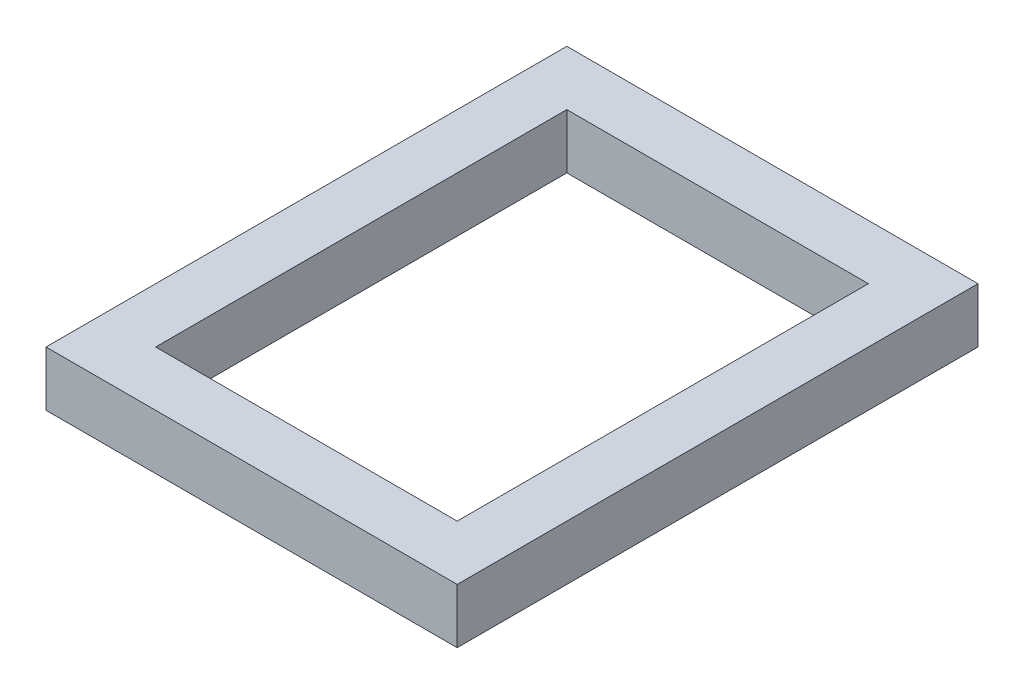
ISO-10303-21;
HEADER;
FILE_DESCRIPTION(('STEP AP214'),'2;1');
FILE_NAME('part.step','',(''),(''),'','','');
FILE_SCHEMA(('AUTOMOTIVE_DESIGN { 1 0 10303 214 1 1 1 1 }'));
ENDSEC;
DATA;
#1=APPLICATION_CONTEXT('core data for automotive mechanical design processes');
#2=APPLICATION_PROTOCOL_DEFINITION('international standard','automotive_design',2000,#1);
#3=PRODUCT_CONTEXT('',#1,'mechanical');
#4=PRODUCT('Part','Part','',(#3));
#5=PRODUCT_RELATED_PRODUCT_CATEGORY('part','',(#4));
#6=PRODUCT_DEFINITION_FORMATION('','',#4);
#7=PRODUCT_DEFINITION_CONTEXT('part definition',#1,'design');
#8=PRODUCT_DEFINITION('design','',#6,#7);
#9=PRODUCT_DEFINITION_SHAPE('','',#8);
#10=(LENGTH_UNIT() NAMED_UNIT(*) SI_UNIT(.MILLI.,.METRE.));
#11=(NAMED_UNIT(*) PLANE_ANGLE_UNIT() SI_UNIT($,.RADIAN.));
#12=(NAMED_UNIT(*) SI_UNIT($,.STERADIAN.) SOLID_ANGLE_UNIT());
#13=UNCERTAINTY_MEASURE_WITH_UNIT(LENGTH_MEASURE(1.E-05),#10,'distance_accuracy_value','');
#14=(GEOMETRIC_REPRESENTATION_CONTEXT(3) GLOBAL_UNCERTAINTY_ASSIGNED_CONTEXT((#13)) GLOBAL_UNIT_ASSIGNED_CONTEXT((#10,
#11,#12)) REPRESENTATION_CONTEXT('',''));
#15=CARTESIAN_POINT('',(0.,0.,0.));
#16=DIRECTION('',(0.,0.,1.));
#17=DIRECTION('',(1.,0.,0.));
#18=AXIS2_PLACEMENT_3D('',#15,#16,#17);
#19=CARTESIAN_POINT('',(0.,12.7,0.));
#20=DIRECTION('',(0.,-1.,0.));
#21=DIRECTION('',(0.,0.,-1.));
#22=AXIS2_PLACEMENT_3D('',#19,#20,#21);
#23=PLANE('',#22);
#24=DIRECTION('',(0.,0.,-1.));
#25=VECTOR('',#24,1.);
#26=CARTESIAN_POINT('',(47.625,12.7,60.325));
#27=LINE('',#26,#25);
#28=CARTESIAN_POINT('',(47.625,12.7,60.325));
#29=VERTEX_POINT('',#28);
#30=CARTESIAN_POINT('',(47.625,12.7,-60.325));
#31=VERTEX_POINT('',#30);
#32=EDGE_CURVE('E134',#29,#31,#27,.T.);
#33=ORIENTED_EDGE('',*,*,#32,.T.);
#34=DIRECTION('',(-1.,0.,0.));
#35=VECTOR('',#34,1.);
#36=CARTESIAN_POINT('',(-47.625,12.7,-60.325));
#37=LINE('',#36,#35);
#38=CARTESIAN_POINT('',(-47.625,12.7,-60.325));
#39=VERTEX_POINT('',#38);
#40=EDGE_CURVE('E137',#31,#39,#37,.T.);
#41=ORIENTED_EDGE('',*,*,#40,.T.);
#42=DIRECTION('',(0.,0.,1.));
#43=VECTOR('',#42,1.);
#44=CARTESIAN_POINT('',(-47.625,12.7,60.325));
#45=LINE('',#44,#43);
#46=CARTESIAN_POINT('',(-47.625,12.7,60.325));
#47=VERTEX_POINT('',#46);
#48=EDGE_CURVE('E140',#39,#47,#45,.T.);
#49=ORIENTED_EDGE('',*,*,#48,.T.);
#50=DIRECTION('',(1.,0.,0.));
#51=VECTOR('',#50,1.);
#52=CARTESIAN_POINT('',(-47.625,12.7,60.325));
#53=LINE('',#52,#51);
#54=EDGE_CURVE('E142',#47,#29,#53,.T.);
#55=ORIENTED_EDGE('',*,*,#54,.T.);
#56=EDGE_LOOP('',(#33,#41,#49,#55));
#57=FACE_BOUND('',#56,.T.);
#58=DIRECTION('',(0.,0.,-1.));
#59=VECTOR('',#58,1.);
#60=CARTESIAN_POINT('',(34.925,12.7,47.625));
#61=LINE('',#60,#59);
#62=CARTESIAN_POINT('',(34.925,12.7,47.625));
#63=VERTEX_POINT('',#62);
#64=CARTESIAN_POINT('',(34.925,12.7,-47.625));
#65=VERTEX_POINT('',#64);
#66=EDGE_CURVE('E98',#63,#65,#61,.T.);
#67=ORIENTED_EDGE('',*,*,#66,.F.);
#68=DIRECTION('',(1.,0.,0.));
#69=VECTOR('',#68,1.);
#70=CARTESIAN_POINT('',(-34.925,12.7,47.625));
#71=LINE('',#70,#69);
#72=CARTESIAN_POINT('',(-34.925,12.7,47.625));
#73=VERTEX_POINT('',#72);
#74=EDGE_CURVE('E120',#73,#63,#71,.T.);
#75=ORIENTED_EDGE('',*,*,#74,.F.);
#76=DIRECTION('',(0.,0.,1.));
#77=VECTOR('',#76,1.);
#78=CARTESIAN_POINT('',(-34.925,12.7,47.625));
#79=LINE('',#78,#77);
#80=CARTESIAN_POINT('',(-34.925,12.7,-47.625));
#81=VERTEX_POINT('',#80);
#82=EDGE_CURVE('E118',#81,#73,#79,.T.);
#83=ORIENTED_EDGE('',*,*,#82,.F.);
#84=DIRECTION('',(-1.,0.,0.));
#85=VECTOR('',#84,1.);
#86=CARTESIAN_POINT('',(-34.925,12.7,-47.625));
#87=LINE('',#86,#85);
#88=EDGE_CURVE('E106',#65,#81,#87,.T.);
#89=ORIENTED_EDGE('',*,*,#88,.F.);
#90=EDGE_LOOP('',(#67,#75,#83,#89));
#91=FACE_BOUND('',#90,.T.);
#92=ADVANCED_FACE('F33',(#57,#91),#23,.F.);
#93=CARTESIAN_POINT('',(0.,0.,0.));
#94=DIRECTION('',(0.,-1.,0.));
#95=DIRECTION('',(0.,0.,-1.));
#96=AXIS2_PLACEMENT_3D('',#93,#94,#95);
#97=PLANE('',#96);
#98=DIRECTION('',(0.,0.,-1.));
#99=VECTOR('',#98,1.);
#100=CARTESIAN_POINT('',(47.625,0.,60.325));
#101=LINE('',#100,#99);
#102=CARTESIAN_POINT('',(47.625,0.,60.325));
#103=VERTEX_POINT('',#102);
#104=CARTESIAN_POINT('',(47.625,0.,-60.325));
#105=VERTEX_POINT('',#104);
#106=EDGE_CURVE('E114',#103,#105,#101,.T.);
#107=ORIENTED_EDGE('',*,*,#106,.F.);
#108=DIRECTION('',(1.,0.,0.));
#109=VECTOR('',#108,1.);
#110=CARTESIAN_POINT('',(-47.625,0.,60.325));
#111=LINE('',#110,#109);
#112=CARTESIAN_POINT('',(-47.625,0.,60.325));
#113=VERTEX_POINT('',#112);
#114=EDGE_CURVE('E138',#113,#103,#111,.T.);
#115=ORIENTED_EDGE('',*,*,#114,.F.);
#116=DIRECTION('',(0.,0.,1.));
#117=VECTOR('',#116,1.);
#118=CARTESIAN_POINT('',(-47.625,0.,60.325));
#119=LINE('',#118,#117);
#120=CARTESIAN_POINT('',(-47.625,0.,-60.325));
#121=VERTEX_POINT('',#120);
#122=EDGE_CURVE('E149',#121,#113,#119,.T.);
#123=ORIENTED_EDGE('',*,*,#122,.F.);
#124=DIRECTION('',(-1.,0.,0.));
#125=VECTOR('',#124,1.);
#126=CARTESIAN_POINT('',(-47.625,0.,-60.325));
#127=LINE('',#126,#125);
#128=EDGE_CURVE('E147',#105,#121,#127,.T.);
#129=ORIENTED_EDGE('',*,*,#128,.F.);
#130=EDGE_LOOP('',(#107,#115,#123,#129));
#131=FACE_BOUND('',#130,.T.);
#132=DIRECTION('',(1.,0.,0.));
#133=VECTOR('',#132,1.);
#134=CARTESIAN_POINT('',(-34.925,0.,47.625));
#135=LINE('',#134,#133);
#136=CARTESIAN_POINT('',(-34.925,0.,47.625));
#137=VERTEX_POINT('',#136);
#138=CARTESIAN_POINT('',(34.925,0.,47.625));
#139=VERTEX_POINT('',#138);
#140=EDGE_CURVE('E107',#137,#139,#135,.T.);
#141=ORIENTED_EDGE('',*,*,#140,.T.);
#142=DIRECTION('',(0.,0.,-1.));
#143=VECTOR('',#142,1.);
#144=CARTESIAN_POINT('',(34.925,0.,47.625));
#145=LINE('',#144,#143);
#146=CARTESIAN_POINT('',(34.925,0.,-47.625));
#147=VERTEX_POINT('',#146);
#148=EDGE_CURVE('E56',#139,#147,#145,.T.);
#149=ORIENTED_EDGE('',*,*,#148,.T.);
#150=DIRECTION('',(-1.,0.,0.));
#151=VECTOR('',#150,1.);
#152=CARTESIAN_POINT('',(-34.925,0.,-47.625));
#153=LINE('',#152,#151);
#154=CARTESIAN_POINT('',(-34.925,0.,-47.625));
#155=VERTEX_POINT('',#154);
#156=EDGE_CURVE('E113',#147,#155,#153,.T.);
#157=ORIENTED_EDGE('',*,*,#156,.T.);
#158=DIRECTION('',(0.,0.,1.));
#159=VECTOR('',#158,1.);
#160=CARTESIAN_POINT('',(-34.925,0.,47.625));
#161=LINE('',#160,#159);
#162=EDGE_CURVE('E126',#155,#137,#161,.T.);
#163=ORIENTED_EDGE('',*,*,#162,.T.);
#164=EDGE_LOOP('',(#141,#149,#157,#163));
#165=FACE_BOUND('',#164,.T.);
#166=ADVANCED_FACE('F167',(#131,#165),#97,.T.);
#167=CARTESIAN_POINT('',(47.625,12.7,60.325));
#168=DIRECTION('',(-1.,0.,0.));
#169=DIRECTION('',(0.,0.,1.));
#170=AXIS2_PLACEMENT_3D('',#167,#168,#169);
#171=PLANE('',#170);
#172=ORIENTED_EDGE('',*,*,#106,.T.);
#173=DIRECTION('',(0.,-1.,0.));
#174=VECTOR('',#173,1.);
#175=CARTESIAN_POINT('',(47.625,12.7,-60.325));
#176=LINE('',#175,#174);
#177=EDGE_CURVE('E11',#31,#105,#176,.T.);
#178=ORIENTED_EDGE('',*,*,#177,.F.);
#179=ORIENTED_EDGE('',*,*,#32,.F.);
#180=DIRECTION('',(0.,-1.,0.));
#181=VECTOR('',#180,1.);
#182=CARTESIAN_POINT('',(47.625,12.7,60.325));
#183=LINE('',#182,#181);
#184=EDGE_CURVE('E144',#29,#103,#183,.T.);
#185=ORIENTED_EDGE('',*,*,#184,.T.);
#186=EDGE_LOOP('',(#172,#178,#179,#185));
#187=FACE_BOUND('',#186,.T.);
#188=ADVANCED_FACE('F35',(#187),#171,.F.);
#189=CARTESIAN_POINT('',(-47.625,12.7,-60.325));
#190=DIRECTION('',(0.,0.,1.));
#191=DIRECTION('',(1.,0.,0.));
#192=AXIS2_PLACEMENT_3D('',#189,#190,#191);
#193=PLANE('',#192);
#194=ORIENTED_EDGE('',*,*,#128,.T.);
#195=DIRECTION('',(0.,-1.,0.));
#196=VECTOR('',#195,1.);
#197=CARTESIAN_POINT('',(-47.625,12.7,-60.325));
#198=LINE('',#197,#196);
#199=EDGE_CURVE('E41',#39,#121,#198,.T.);
#200=ORIENTED_EDGE('',*,*,#199,.F.);
#201=ORIENTED_EDGE('',*,*,#40,.F.);
#202=ORIENTED_EDGE('',*,*,#177,.T.);
#203=EDGE_LOOP('',(#194,#200,#201,#202));
#204=FACE_BOUND('',#203,.T.);
#205=ADVANCED_FACE('F177',(#204),#193,.F.);
#206=CARTESIAN_POINT('',(-47.625,12.7,60.325));
#207=DIRECTION('',(1.,0.,0.));
#208=DIRECTION('',(0.,0.,-1.));
#209=AXIS2_PLACEMENT_3D('',#206,#207,#208);
#210=PLANE('',#209);
#211=ORIENTED_EDGE('',*,*,#122,.T.);
#212=DIRECTION('',(0.,-1.,0.));
#213=VECTOR('',#212,1.);
#214=CARTESIAN_POINT('',(-47.625,12.7,60.325));
#215=LINE('',#214,#213);
#216=EDGE_CURVE('E154',#47,#113,#215,.T.);
#217=ORIENTED_EDGE('',*,*,#216,.F.);
#218=ORIENTED_EDGE('',*,*,#48,.F.);
#219=ORIENTED_EDGE('',*,*,#199,.T.);
#220=EDGE_LOOP('',(#211,#217,#218,#219));
#221=FACE_BOUND('',#220,.T.);
#222=ADVANCED_FACE('F161',(#221),#210,.F.);
#223=CARTESIAN_POINT('',(-47.625,12.7,60.325));
#224=DIRECTION('',(0.,0.,-1.));
#225=DIRECTION('',(-1.,0.,0.));
#226=AXIS2_PLACEMENT_3D('',#223,#224,#225);
#227=PLANE('',#226);
#228=ORIENTED_EDGE('',*,*,#114,.T.);
#229=ORIENTED_EDGE('',*,*,#184,.F.);
#230=ORIENTED_EDGE('',*,*,#54,.F.);
#231=ORIENTED_EDGE('',*,*,#216,.T.);
#232=EDGE_LOOP('',(#228,#229,#230,#231));
#233=FACE_BOUND('',#232,.T.);
#234=ADVANCED_FACE('F171',(#233),#227,.F.);
#235=CARTESIAN_POINT('',(34.925,12.7,47.625));
#236=DIRECTION('',(-1.,0.,0.));
#237=DIRECTION('',(0.,0.,1.));
#238=AXIS2_PLACEMENT_3D('',#235,#236,#237);
#239=PLANE('',#238);
#240=ORIENTED_EDGE('',*,*,#148,.F.);
#241=DIRECTION('',(0.,-1.,0.));
#242=VECTOR('',#241,1.);
#243=CARTESIAN_POINT('',(34.925,12.7,47.625));
#244=LINE('',#243,#242);
#245=EDGE_CURVE('E102',#63,#139,#244,.T.);
#246=ORIENTED_EDGE('',*,*,#245,.F.);
#247=ORIENTED_EDGE('',*,*,#66,.T.);
#248=DIRECTION('',(0.,-1.,0.));
#249=VECTOR('',#248,1.);
#250=CARTESIAN_POINT('',(34.925,12.7,-47.625));
#251=LINE('',#250,#249);
#252=EDGE_CURVE('E101',#65,#147,#251,.T.);
#253=ORIENTED_EDGE('',*,*,#252,.T.);
#254=EDGE_LOOP('',(#240,#246,#247,#253));
#255=FACE_BOUND('',#254,.T.);
#256=ADVANCED_FACE('F100',(#255),#239,.T.);
#257=CARTESIAN_POINT('',(-34.925,12.7,-47.625));
#258=DIRECTION('',(0.,0.,1.));
#259=DIRECTION('',(1.,0.,0.));
#260=AXIS2_PLACEMENT_3D('',#257,#258,#259);
#261=PLANE('',#260);
#262=ORIENTED_EDGE('',*,*,#156,.F.);
#263=ORIENTED_EDGE('',*,*,#252,.F.);
#264=ORIENTED_EDGE('',*,*,#88,.T.);
#265=DIRECTION('',(0.,-1.,0.));
#266=VECTOR('',#265,1.);
#267=CARTESIAN_POINT('',(-34.925,12.7,-47.625));
#268=LINE('',#267,#266);
#269=EDGE_CURVE('E115',#81,#155,#268,.T.);
#270=ORIENTED_EDGE('',*,*,#269,.T.);
#271=EDGE_LOOP('',(#262,#263,#264,#270));
#272=FACE_BOUND('',#271,.T.);
#273=ADVANCED_FACE('F110',(#272),#261,.T.);
#274=CARTESIAN_POINT('',(-34.925,12.7,47.625));
#275=DIRECTION('',(1.,0.,0.));
#276=DIRECTION('',(0.,0.,-1.));
#277=AXIS2_PLACEMENT_3D('',#274,#275,#276);
#278=PLANE('',#277);
#279=ORIENTED_EDGE('',*,*,#162,.F.);
#280=ORIENTED_EDGE('',*,*,#269,.F.);
#281=ORIENTED_EDGE('',*,*,#82,.T.);
#282=DIRECTION('',(0.,-1.,0.));
#283=VECTOR('',#282,1.);
#284=CARTESIAN_POINT('',(-34.925,12.7,47.625));
#285=LINE('',#284,#283);
#286=EDGE_CURVE('E48',#73,#137,#285,.T.);
#287=ORIENTED_EDGE('',*,*,#286,.T.);
#288=EDGE_LOOP('',(#279,#280,#281,#287));
#289=FACE_BOUND('',#288,.T.);
#290=ADVANCED_FACE('F200',(#289),#278,.T.);
#291=CARTESIAN_POINT('',(-34.925,12.7,47.625));
#292=DIRECTION('',(0.,0.,-1.));
#293=DIRECTION('',(-1.,0.,0.));
#294=AXIS2_PLACEMENT_3D('',#291,#292,#293);
#295=PLANE('',#294);
#296=ORIENTED_EDGE('',*,*,#140,.F.);
#297=ORIENTED_EDGE('',*,*,#286,.F.);
#298=ORIENTED_EDGE('',*,*,#74,.T.);
#299=ORIENTED_EDGE('',*,*,#245,.T.);
#300=EDGE_LOOP('',(#296,#297,#298,#299));
#301=FACE_BOUND('',#300,.T.);
#302=ADVANCED_FACE('F204',(#301),#295,.T.);
#303=CLOSED_SHELL('',(#92,#166,#188,#205,#222,#234,#256,#273,#290,#302));
#304=MANIFOLD_SOLID_BREP('B2',#303);
#305=ADVANCED_BREP_SHAPE_REPRESENTATION('',(#18,#304),#14);
#306=SHAPE_DEFINITION_REPRESENTATION(#9,#305);
ENDSEC;
END-ISO-10303-21;
